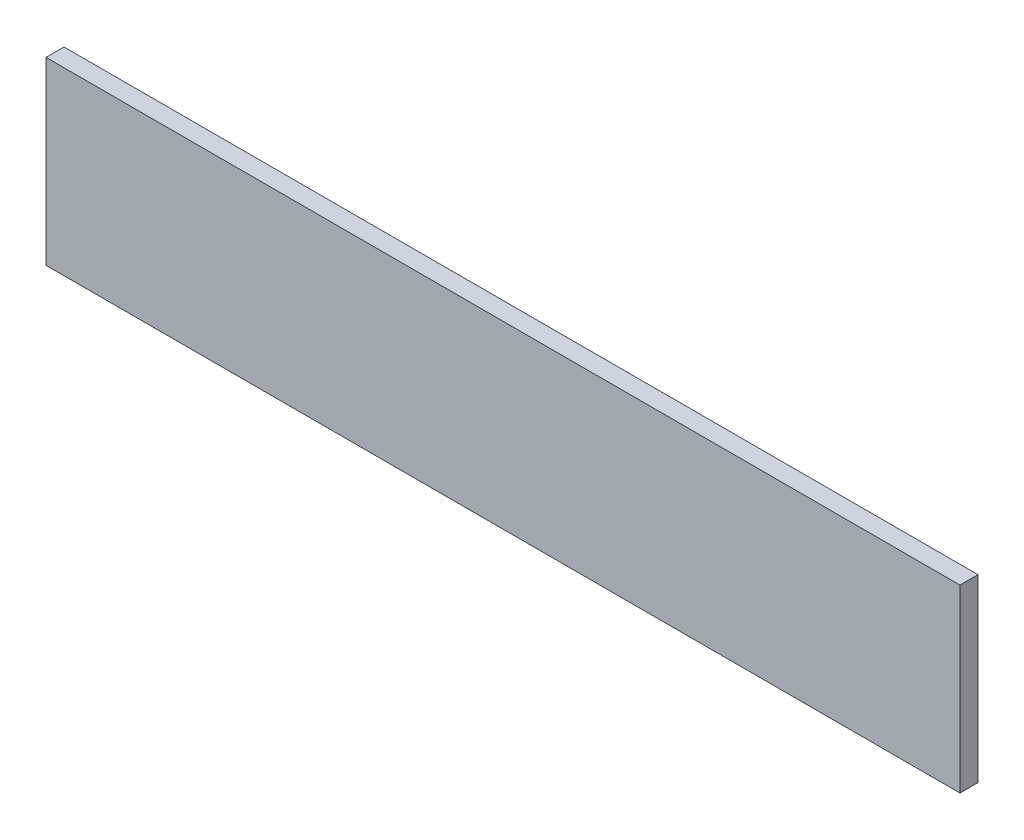
ISO-10303-21;
HEADER;
FILE_DESCRIPTION(('STEP AP214'),'2;1');
FILE_NAME('part.step','',(''),(''),'','','');
FILE_SCHEMA(('AUTOMOTIVE_DESIGN { 1 0 10303 214 1 1 1 1 }'));
ENDSEC;
DATA;
#1=APPLICATION_CONTEXT('core data for automotive mechanical design processes');
#2=APPLICATION_PROTOCOL_DEFINITION('international standard','automotive_design',2000,#1);
#3=PRODUCT_CONTEXT('',#1,'mechanical');
#4=PRODUCT('Part','Part','',(#3));
#5=PRODUCT_RELATED_PRODUCT_CATEGORY('part','',(#4));
#6=PRODUCT_DEFINITION_FORMATION('','',#4);
#7=PRODUCT_DEFINITION_CONTEXT('part definition',#1,'design');
#8=PRODUCT_DEFINITION('design','',#6,#7);
#9=PRODUCT_DEFINITION_SHAPE('','',#8);
#10=(LENGTH_UNIT() NAMED_UNIT(*) SI_UNIT(.MILLI.,.METRE.));
#11=(NAMED_UNIT(*) PLANE_ANGLE_UNIT() SI_UNIT($,.RADIAN.));
#12=(NAMED_UNIT(*) SI_UNIT($,.STERADIAN.) SOLID_ANGLE_UNIT());
#13=UNCERTAINTY_MEASURE_WITH_UNIT(LENGTH_MEASURE(1.E-05),#10,'distance_accuracy_value','');
#14=(GEOMETRIC_REPRESENTATION_CONTEXT(3) GLOBAL_UNCERTAINTY_ASSIGNED_CONTEXT((#13)) GLOBAL_UNIT_ASSIGNED_CONTEXT((#10,
#11,#12)) REPRESENTATION_CONTEXT('',''));
#15=CARTESIAN_POINT('',(0.,0.,0.));
#16=DIRECTION('',(0.,0.,1.));
#17=DIRECTION('',(1.,0.,0.));
#18=AXIS2_PLACEMENT_3D('',#15,#16,#17);
#19=CARTESIAN_POINT('',(0.,0.,100.));
#20=DIRECTION('',(1.,0.,0.));
#21=DIRECTION('',(0.,0.,-1.));
#22=AXIS2_PLACEMENT_3D('',#19,#20,#21);
#23=PLANE('',#22);
#24=DIRECTION('',(0.,-1.,0.));
#25=VECTOR('',#24,1.);
#26=CARTESIAN_POINT('',(0.,0.,0.));
#27=LINE('',#26,#25);
#28=CARTESIAN_POINT('',(0.,0.,0.));
#29=VERTEX_POINT('',#28);
#30=CARTESIAN_POINT('',(0.,-1000.,0.));
#31=VERTEX_POINT('',#30);
#32=EDGE_CURVE('E107',#29,#31,#27,.T.);
#33=ORIENTED_EDGE('',*,*,#32,.T.);
#34=DIRECTION('',(0.,0.,-1.));
#35=VECTOR('',#34,1.);
#36=CARTESIAN_POINT('',(0.,-1000.,100.));
#37=LINE('',#36,#35);
#38=CARTESIAN_POINT('',(0.,-1000.,100.));
#39=VERTEX_POINT('',#38);
#40=EDGE_CURVE('E11',#39,#31,#37,.T.);
#41=ORIENTED_EDGE('',*,*,#40,.F.);
#42=DIRECTION('',(0.,-1.,0.));
#43=VECTOR('',#42,1.);
#44=CARTESIAN_POINT('',(0.,0.,100.));
#45=LINE('',#44,#43);
#46=CARTESIAN_POINT('',(0.,0.,100.));
#47=VERTEX_POINT('',#46);
#48=EDGE_CURVE('E91',#47,#39,#45,.T.);
#49=ORIENTED_EDGE('',*,*,#48,.F.);
#50=DIRECTION('',(0.,0.,-1.));
#51=VECTOR('',#50,1.);
#52=CARTESIAN_POINT('',(0.,0.,100.));
#53=LINE('',#52,#51);
#54=EDGE_CURVE('E103',#47,#29,#53,.T.);
#55=ORIENTED_EDGE('',*,*,#54,.T.);
#56=EDGE_LOOP('',(#33,#41,#49,#55));
#57=FACE_BOUND('',#56,.T.);
#58=ADVANCED_FACE('F39',(#57),#23,.F.);
#59=CARTESIAN_POINT('',(0.,-1000.,100.));
#60=DIRECTION('',(0.,1.,0.));
#61=DIRECTION('',(0.,0.,1.));
#62=AXIS2_PLACEMENT_3D('',#59,#60,#61);
#63=PLANE('',#62);
#64=DIRECTION('',(1.,0.,0.));
#65=VECTOR('',#64,1.);
#66=CARTESIAN_POINT('',(0.,-1000.,0.));
#67=LINE('',#66,#65);
#68=CARTESIAN_POINT('',(5075.,-1000.,0.));
#69=VERTEX_POINT('',#68);
#70=EDGE_CURVE('E96',#31,#69,#67,.T.);
#71=ORIENTED_EDGE('',*,*,#70,.T.);
#72=DIRECTION('',(0.,0.,-1.));
#73=VECTOR('',#72,1.);
#74=CARTESIAN_POINT('',(5075.,-1000.,100.));
#75=LINE('',#74,#73);
#76=CARTESIAN_POINT('',(5075.,-1000.,100.));
#77=VERTEX_POINT('',#76);
#78=EDGE_CURVE('E48',#77,#69,#75,.T.);
#79=ORIENTED_EDGE('',*,*,#78,.F.);
#80=DIRECTION('',(1.,0.,0.));
#81=VECTOR('',#80,1.);
#82=CARTESIAN_POINT('',(0.,-1000.,100.));
#83=LINE('',#82,#81);
#84=EDGE_CURVE('E86',#39,#77,#83,.T.);
#85=ORIENTED_EDGE('',*,*,#84,.F.);
#86=ORIENTED_EDGE('',*,*,#40,.T.);
#87=EDGE_LOOP('',(#71,#79,#85,#86));
#88=FACE_BOUND('',#87,.T.);
#89=ADVANCED_FACE('F95',(#88),#63,.F.);
#90=CARTESIAN_POINT('',(5075.,0.,100.));
#91=DIRECTION('',(-1.,0.,0.));
#92=DIRECTION('',(0.,0.,1.));
#93=AXIS2_PLACEMENT_3D('',#90,#91,#92);
#94=PLANE('',#93);
#95=DIRECTION('',(0.,1.,0.));
#96=VECTOR('',#95,1.);
#97=CARTESIAN_POINT('',(5075.,0.,0.));
#98=LINE('',#97,#96);
#99=CARTESIAN_POINT('',(5075.,0.,0.));
#100=VERTEX_POINT('',#99);
#101=EDGE_CURVE('E73',#69,#100,#98,.T.);
#102=ORIENTED_EDGE('',*,*,#101,.T.);
#103=DIRECTION('',(0.,0.,-1.));
#104=VECTOR('',#103,1.);
#105=CARTESIAN_POINT('',(5075.,0.,100.));
#106=LINE('',#105,#104);
#107=CARTESIAN_POINT('',(5075.,0.,100.));
#108=VERTEX_POINT('',#107);
#109=EDGE_CURVE('E98',#108,#100,#106,.T.);
#110=ORIENTED_EDGE('',*,*,#109,.F.);
#111=DIRECTION('',(0.,1.,0.));
#112=VECTOR('',#111,1.);
#113=CARTESIAN_POINT('',(5075.,0.,100.));
#114=LINE('',#113,#112);
#115=EDGE_CURVE('E89',#77,#108,#114,.T.);
#116=ORIENTED_EDGE('',*,*,#115,.F.);
#117=ORIENTED_EDGE('',*,*,#78,.T.);
#118=EDGE_LOOP('',(#102,#110,#116,#117));
#119=FACE_BOUND('',#118,.T.);
#120=ADVANCED_FACE('F99',(#119),#94,.F.);
#121=CARTESIAN_POINT('',(0.,0.,100.));
#122=DIRECTION('',(0.,-1.,0.));
#123=DIRECTION('',(0.,0.,-1.));
#124=AXIS2_PLACEMENT_3D('',#121,#122,#123);
#125=PLANE('',#124);
#126=DIRECTION('',(-1.,0.,0.));
#127=VECTOR('',#126,1.);
#128=CARTESIAN_POINT('',(0.,0.,0.));
#129=LINE('',#128,#127);
#130=EDGE_CURVE('E79',#100,#29,#129,.T.);
#131=ORIENTED_EDGE('',*,*,#130,.T.);
#132=ORIENTED_EDGE('',*,*,#54,.F.);
#133=DIRECTION('',(-1.,0.,0.));
#134=VECTOR('',#133,1.);
#135=CARTESIAN_POINT('',(0.,0.,100.));
#136=LINE('',#135,#134);
#137=EDGE_CURVE('E56',#108,#47,#136,.T.);
#138=ORIENTED_EDGE('',*,*,#137,.F.);
#139=ORIENTED_EDGE('',*,*,#109,.T.);
#140=EDGE_LOOP('',(#131,#132,#138,#139));
#141=FACE_BOUND('',#140,.T.);
#142=ADVANCED_FACE('F120',(#141),#125,.F.);
#143=CARTESIAN_POINT('',(0.,0.,100.));
#144=DIRECTION('',(0.,0.,1.));
#145=DIRECTION('',(1.,0.,0.));
#146=AXIS2_PLACEMENT_3D('',#143,#144,#145);
#147=PLANE('',#146);
#148=ORIENTED_EDGE('',*,*,#48,.T.);
#149=ORIENTED_EDGE('',*,*,#84,.T.);
#150=ORIENTED_EDGE('',*,*,#115,.T.);
#151=ORIENTED_EDGE('',*,*,#137,.T.);
#152=EDGE_LOOP('',(#148,#149,#150,#151));
#153=FACE_BOUND('',#152,.T.);
#154=ADVANCED_FACE('F87',(#153),#147,.T.);
#155=CARTESIAN_POINT('',(0.,0.,0.));
#156=DIRECTION('',(0.,0.,1.));
#157=DIRECTION('',(1.,0.,0.));
#158=AXIS2_PLACEMENT_3D('',#155,#156,#157);
#159=PLANE('',#158);
#160=ORIENTED_EDGE('',*,*,#32,.F.);
#161=ORIENTED_EDGE('',*,*,#130,.F.);
#162=ORIENTED_EDGE('',*,*,#101,.F.);
#163=ORIENTED_EDGE('',*,*,#70,.F.);
#164=EDGE_LOOP('',(#160,#161,#162,#163));
#165=FACE_BOUND('',#164,.T.);
#166=ADVANCED_FACE('F123',(#165),#159,.F.);
#167=CLOSED_SHELL('',(#58,#89,#120,#142,#154,#166));
#168=MANIFOLD_SOLID_BREP('B2',#167);
#169=ADVANCED_BREP_SHAPE_REPRESENTATION('',(#18,#168),#14);
#170=SHAPE_DEFINITION_REPRESENTATION(#9,#169);
ENDSEC;
END-ISO-10303-21;
